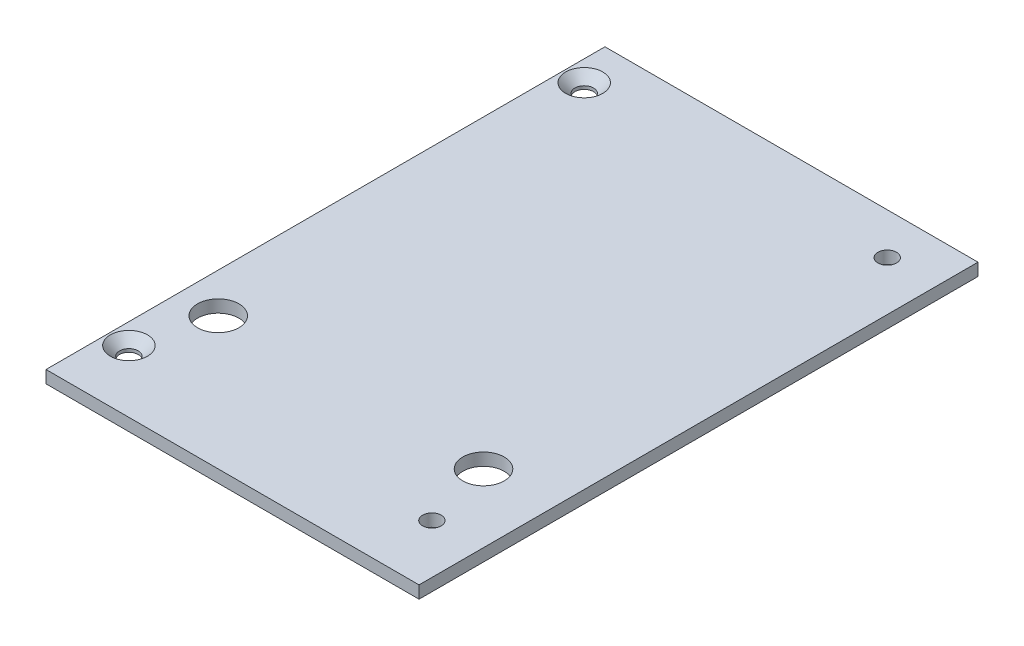
ISO-10303-21;
HEADER;
FILE_DESCRIPTION(('STEP AP214'),'2;1');
FILE_NAME('part.step','',(''),(''),'','','');
FILE_SCHEMA(('AUTOMOTIVE_DESIGN { 1 0 10303 214 1 1 1 1 }'));
ENDSEC;
DATA;
#1=APPLICATION_CONTEXT('core data for automotive mechanical design processes');
#2=APPLICATION_PROTOCOL_DEFINITION('international standard','automotive_design',2000,#1);
#3=PRODUCT_CONTEXT('',#1,'mechanical');
#4=PRODUCT('Part','Part','',(#3));
#5=PRODUCT_RELATED_PRODUCT_CATEGORY('part','',(#4));
#6=PRODUCT_DEFINITION_FORMATION('','',#4);
#7=PRODUCT_DEFINITION_CONTEXT('part definition',#1,'design');
#8=PRODUCT_DEFINITION('design','',#6,#7);
#9=PRODUCT_DEFINITION_SHAPE('','',#8);
#10=(LENGTH_UNIT() NAMED_UNIT(*) SI_UNIT(.MILLI.,.METRE.));
#11=(NAMED_UNIT(*) PLANE_ANGLE_UNIT() SI_UNIT($,.RADIAN.));
#12=(NAMED_UNIT(*) SI_UNIT($,.STERADIAN.) SOLID_ANGLE_UNIT());
#13=UNCERTAINTY_MEASURE_WITH_UNIT(LENGTH_MEASURE(1.E-05),#10,'distance_accuracy_value','');
#14=(GEOMETRIC_REPRESENTATION_CONTEXT(3) GLOBAL_UNCERTAINTY_ASSIGNED_CONTEXT((#13)) GLOBAL_UNIT_ASSIGNED_CONTEXT((#10,
#11,#12)) REPRESENTATION_CONTEXT('',''));
#15=CARTESIAN_POINT('',(0.,0.,0.));
#16=DIRECTION('',(0.,0.,1.));
#17=DIRECTION('',(1.,0.,0.));
#18=AXIS2_PLACEMENT_3D('',#15,#16,#17);
#19=CARTESIAN_POINT('',(0.,3.,0.));
#20=DIRECTION('',(0.,-1.,0.));
#21=DIRECTION('',(0.,0.,-1.));
#22=AXIS2_PLACEMENT_3D('',#19,#20,#21);
#23=PLANE('',#22);
#24=CARTESIAN_POINT('',(-40.,3.,52.425));
#25=DIRECTION('',(0.,1.,0.));
#26=DIRECTION('',(0.,0.,1.));
#27=AXIS2_PLACEMENT_3D('',#24,#25,#26);
#28=CIRCLE('',#27,4.48);
#29=CARTESIAN_POINT('',(-40.,3.,56.905));
#30=VERTEX_POINT('',#29);
#31=EDGE_CURVE('E522',#30,#30,#28,.T.);
#32=ORIENTED_EDGE('',*,*,#31,.F.);
#33=EDGE_LOOP('',(#32));
#34=FACE_BOUND('',#33,.T.);
#35=CARTESIAN_POINT('',(33.1,3.,52.425));
#36=DIRECTION('',(0.,1.,0.));
#37=DIRECTION('',(0.,0.,1.));
#38=AXIS2_PLACEMENT_3D('',#35,#36,#37);
#39=CIRCLE('',#38,2.24999999999319);
#40=CARTESIAN_POINT('',(33.1,3.,54.6749999999932));
#41=VERTEX_POINT('',#40);
#42=EDGE_CURVE('E267',#41,#41,#39,.T.);
#43=ORIENTED_EDGE('',*,*,#42,.F.);
#44=EDGE_LOOP('',(#43));
#45=FACE_BOUND('',#44,.T.);
#46=CARTESIAN_POINT('',(33.1,3.,-57.425));
#47=DIRECTION('',(0.,1.,0.));
#48=DIRECTION('',(0.,0.,1.));
#49=AXIS2_PLACEMENT_3D('',#46,#47,#48);
#50=CIRCLE('',#49,2.24999999999318);
#51=CARTESIAN_POINT('',(33.1,3.,-55.1750000000068));
#52=VERTEX_POINT('',#51);
#53=EDGE_CURVE('E273',#52,#52,#50,.T.);
#54=ORIENTED_EDGE('',*,*,#53,.F.);
#55=EDGE_LOOP('',(#54));
#56=FACE_BOUND('',#55,.T.);
#57=DIRECTION('',(0.,0.,-1.));
#58=VECTOR('',#57,1.);
#59=CARTESIAN_POINT('',(45.,3.,67.425));
#60=LINE('',#59,#58);
#61=CARTESIAN_POINT('',(45.,3.,67.425));
#62=VERTEX_POINT('',#61);
#63=CARTESIAN_POINT('',(45.,3.,-67.425));
#64=VERTEX_POINT('',#63);
#65=EDGE_CURVE('E282',#62,#64,#60,.T.);
#66=ORIENTED_EDGE('',*,*,#65,.T.);
#67=DIRECTION('',(-1.,0.,0.));
#68=VECTOR('',#67,1.);
#69=CARTESIAN_POINT('',(-45.,3.,-67.425));
#70=LINE('',#69,#68);
#71=CARTESIAN_POINT('',(-45.,3.,-67.425));
#72=VERTEX_POINT('',#71);
#73=EDGE_CURVE('E285',#64,#72,#70,.T.);
#74=ORIENTED_EDGE('',*,*,#73,.T.);
#75=DIRECTION('',(0.,0.,1.));
#76=VECTOR('',#75,1.);
#77=CARTESIAN_POINT('',(-45.,3.,67.425));
#78=LINE('',#77,#76);
#79=CARTESIAN_POINT('',(-45.,3.,67.425));
#80=VERTEX_POINT('',#79);
#81=EDGE_CURVE('E288',#72,#80,#78,.T.);
#82=ORIENTED_EDGE('',*,*,#81,.T.);
#83=DIRECTION('',(1.,0.,0.));
#84=VECTOR('',#83,1.);
#85=CARTESIAN_POINT('',(-45.,3.,67.425));
#86=LINE('',#85,#84);
#87=EDGE_CURVE('E290',#80,#62,#86,.T.);
#88=ORIENTED_EDGE('',*,*,#87,.T.);
#89=EDGE_LOOP('',(#66,#74,#82,#88));
#90=FACE_BOUND('',#89,.T.);
#91=CARTESIAN_POINT('',(28.55,3.,35.425));
#92=DIRECTION('',(0.,-1.,0.));
#93=DIRECTION('',(0.,0.,-1.));
#94=AXIS2_PLACEMENT_3D('',#91,#92,#93);
#95=CIRCLE('',#94,5.);
#96=CARTESIAN_POINT('',(28.55,3.,30.425));
#97=VERTEX_POINT('',#96);
#98=EDGE_CURVE('E255',#97,#97,#95,.T.);
#99=ORIENTED_EDGE('',*,*,#98,.T.);
#100=EDGE_LOOP('',(#99));
#101=FACE_BOUND('',#100,.T.);
#102=CARTESIAN_POINT('',(-35.45,3.,35.425));
#103=DIRECTION('',(0.,-1.,0.));
#104=DIRECTION('',(0.,0.,-1.));
#105=AXIS2_PLACEMENT_3D('',#102,#103,#104);
#106=CIRCLE('',#105,5.00000000000001);
#107=CARTESIAN_POINT('',(-35.45,3.,30.425));
#108=VERTEX_POINT('',#107);
#109=EDGE_CURVE('E260',#108,#108,#106,.T.);
#110=ORIENTED_EDGE('',*,*,#109,.T.);
#111=EDGE_LOOP('',(#110));
#112=FACE_BOUND('',#111,.T.);
#113=CARTESIAN_POINT('',(-40.,3.,-57.425));
#114=DIRECTION('',(0.,1.,0.));
#115=DIRECTION('',(0.,0.,1.));
#116=AXIS2_PLACEMENT_3D('',#113,#114,#115);
#117=CIRCLE('',#116,4.48);
#118=CARTESIAN_POINT('',(-40.,3.,-52.945));
#119=VERTEX_POINT('',#118);
#120=EDGE_CURVE('E517',#119,#119,#117,.T.);
#121=ORIENTED_EDGE('',*,*,#120,.F.);
#122=EDGE_LOOP('',(#121));
#123=FACE_BOUND('',#122,.T.);
#124=ADVANCED_FACE('F39',(#34,#45,#56,#90,#101,#112,#123),#23,.F.);
#125=CARTESIAN_POINT('',(-40.,3.,-57.425));
#126=DIRECTION('',(0.,-1.,0.));
#127=DIRECTION('',(0.,0.,-1.));
#128=AXIS2_PLACEMENT_3D('',#125,#126,#127);
#129=CYLINDRICAL_SURFACE('',#128,2.24999999999319);
#130=CARTESIAN_POINT('',(-40.,0.,-57.425));
#131=DIRECTION('',(0.,1.,0.));
#132=DIRECTION('',(0.,0.,1.));
#133=AXIS2_PLACEMENT_3D('',#130,#131,#132);
#134=CIRCLE('',#133,2.24999999999319);
#135=CARTESIAN_POINT('',(-40.,0.,-55.1750000000068));
#136=VERTEX_POINT('',#135);
#137=EDGE_CURVE('E276',#136,#136,#134,.T.);
#138=ORIENTED_EDGE('',*,*,#137,.F.);
#139=EDGE_LOOP('',(#138));
#140=FACE_BOUND('',#139,.T.);
#141=CARTESIAN_POINT('',(-40.,0.769999999999999,-57.425));
#142=DIRECTION('',(0.,1.,0.));
#143=DIRECTION('',(0.,0.,1.));
#144=AXIS2_PLACEMENT_3D('',#141,#142,#143);
#145=CIRCLE('',#144,2.25);
#146=CARTESIAN_POINT('',(-40.,0.769999999999999,-55.175));
#147=VERTEX_POINT('',#146);
#148=EDGE_CURVE('E185',#147,#147,#145,.T.);
#149=ORIENTED_EDGE('',*,*,#148,.T.);
#150=EDGE_LOOP('',(#149));
#151=FACE_BOUND('',#150,.T.);
#152=ADVANCED_FACE('F331',(#140,#151),#129,.F.);
#153=CARTESIAN_POINT('',(0.,0.,0.));
#154=DIRECTION('',(0.,-1.,0.));
#155=DIRECTION('',(0.,0.,-1.));
#156=AXIS2_PLACEMENT_3D('',#153,#154,#155);
#157=PLANE('',#156);
#158=CARTESIAN_POINT('',(-40.,0.,52.425));
#159=DIRECTION('',(0.,1.,0.));
#160=DIRECTION('',(0.,0.,1.));
#161=AXIS2_PLACEMENT_3D('',#158,#159,#160);
#162=CIRCLE('',#161,2.24999999999316);
#163=CARTESIAN_POINT('',(-40.,0.,54.6749999999932));
#164=VERTEX_POINT('',#163);
#165=EDGE_CURVE('E263',#164,#164,#162,.T.);
#166=ORIENTED_EDGE('',*,*,#165,.T.);
#167=EDGE_LOOP('',(#166));
#168=FACE_BOUND('',#167,.T.);
#169=CARTESIAN_POINT('',(33.1,0.,-57.425));
#170=DIRECTION('',(0.,1.,0.));
#171=DIRECTION('',(0.,0.,1.));
#172=AXIS2_PLACEMENT_3D('',#169,#170,#171);
#173=CIRCLE('',#172,2.24999999999318);
#174=CARTESIAN_POINT('',(33.1,0.,-55.1750000000068));
#175=VERTEX_POINT('',#174);
#176=EDGE_CURVE('E270',#175,#175,#173,.T.);
#177=ORIENTED_EDGE('',*,*,#176,.T.);
#178=EDGE_LOOP('',(#177));
#179=FACE_BOUND('',#178,.T.);
#180=DIRECTION('',(0.,0.,-1.));
#181=VECTOR('',#180,1.);
#182=CARTESIAN_POINT('',(45.,0.,67.425));
#183=LINE('',#182,#181);
#184=CARTESIAN_POINT('',(45.,0.,67.425));
#185=VERTEX_POINT('',#184);
#186=CARTESIAN_POINT('',(45.,0.,-67.425));
#187=VERTEX_POINT('',#186);
#188=EDGE_CURVE('E281',#185,#187,#183,.T.);
#189=ORIENTED_EDGE('',*,*,#188,.F.);
#190=DIRECTION('',(1.,0.,0.));
#191=VECTOR('',#190,1.);
#192=CARTESIAN_POINT('',(-45.,0.,67.425));
#193=LINE('',#192,#191);
#194=CARTESIAN_POINT('',(-45.,0.,67.425));
#195=VERTEX_POINT('',#194);
#196=EDGE_CURVE('E286',#195,#185,#193,.T.);
#197=ORIENTED_EDGE('',*,*,#196,.F.);
#198=DIRECTION('',(0.,0.,1.));
#199=VECTOR('',#198,1.);
#200=CARTESIAN_POINT('',(-45.,0.,67.425));
#201=LINE('',#200,#199);
#202=CARTESIAN_POINT('',(-45.,0.,-67.425));
#203=VERTEX_POINT('',#202);
#204=EDGE_CURVE('E297',#203,#195,#201,.T.);
#205=ORIENTED_EDGE('',*,*,#204,.F.);
#206=DIRECTION('',(-1.,0.,0.));
#207=VECTOR('',#206,1.);
#208=CARTESIAN_POINT('',(-45.,0.,-67.425));
#209=LINE('',#208,#207);
#210=EDGE_CURVE('E295',#187,#203,#209,.T.);
#211=ORIENTED_EDGE('',*,*,#210,.F.);
#212=EDGE_LOOP('',(#189,#197,#205,#211));
#213=FACE_BOUND('',#212,.T.);
#214=ORIENTED_EDGE('',*,*,#137,.T.);
#215=EDGE_LOOP('',(#214));
#216=FACE_BOUND('',#215,.T.);
#217=CARTESIAN_POINT('',(33.1,0.,52.425));
#218=DIRECTION('',(0.,1.,0.));
#219=DIRECTION('',(0.,0.,1.));
#220=AXIS2_PLACEMENT_3D('',#217,#218,#219);
#221=CIRCLE('',#220,2.24999999999319);
#222=CARTESIAN_POINT('',(33.1,0.,54.6749999999932));
#223=VERTEX_POINT('',#222);
#224=EDGE_CURVE('E266',#223,#223,#221,.T.);
#225=ORIENTED_EDGE('',*,*,#224,.T.);
#226=EDGE_LOOP('',(#225));
#227=FACE_BOUND('',#226,.T.);
#228=CARTESIAN_POINT('',(28.55,0.,35.425));
#229=DIRECTION('',(0.,-1.,0.));
#230=DIRECTION('',(0.,0.,-1.));
#231=AXIS2_PLACEMENT_3D('',#228,#229,#230);
#232=CIRCLE('',#231,5.);
#233=CARTESIAN_POINT('',(28.55,0.,30.425));
#234=VERTEX_POINT('',#233);
#235=EDGE_CURVE('E251',#234,#234,#232,.T.);
#236=ORIENTED_EDGE('',*,*,#235,.F.);
#237=EDGE_LOOP('',(#236));
#238=FACE_BOUND('',#237,.T.);
#239=CARTESIAN_POINT('',(-35.45,0.,35.425));
#240=DIRECTION('',(0.,-1.,0.));
#241=DIRECTION('',(0.,0.,-1.));
#242=AXIS2_PLACEMENT_3D('',#239,#240,#241);
#243=CIRCLE('',#242,5.00000000000001);
#244=CARTESIAN_POINT('',(-35.45,0.,30.425));
#245=VERTEX_POINT('',#244);
#246=EDGE_CURVE('E252',#245,#245,#243,.T.);
#247=ORIENTED_EDGE('',*,*,#246,.F.);
#248=EDGE_LOOP('',(#247));
#249=FACE_BOUND('',#248,.T.);
#250=DIRECTION('',(0.,0.,-1.));
#251=VECTOR('',#250,1.);
#252=CARTESIAN_POINT('',(-34.6,0.,-0.380630601541221));
#253=LINE('',#252,#251);
#254=CARTESIAN_POINT('',(-34.6,0.,-0.380630601541221));
#255=VERTEX_POINT('',#254);
#256=CARTESIAN_POINT('',(-34.6,0.,-67.025));
#257=VERTEX_POINT('',#256);
#258=EDGE_CURVE('E216',#255,#257,#253,.T.);
#259=ORIENTED_EDGE('',*,*,#258,.F.);
#260=CARTESIAN_POINT('',(-30.0000000000001,0.,-0.38063060154122));
#261=DIRECTION('',(0.,-1.,0.));
#262=DIRECTION('',(0.,0.,-1.));
#263=AXIS2_PLACEMENT_3D('',#260,#261,#262);
#264=CIRCLE('',#263,4.59999999999989);
#265=CARTESIAN_POINT('',(-33.8902654821632,0.,2.07412691770368));
#266=VERTEX_POINT('',#265);
#267=EDGE_CURVE('E194',#266,#255,#264,.T.);
#268=ORIENTED_EDGE('',*,*,#267,.F.);
#269=DIRECTION('',(-0.533642938966297,0.,-0.845709887426778));
#270=VECTOR('',#269,1.);
#271=CARTESIAN_POINT('',(-7.34026548216318,0.,44.15019664829));
#272=LINE('',#271,#270);
#273=CARTESIAN_POINT('',(-7.34026548216318,0.,44.15019664829));
#274=VERTEX_POINT('',#273);
#275=EDGE_CURVE('E199',#274,#266,#272,.T.);
#276=ORIENTED_EDGE('',*,*,#275,.F.);
#277=CARTESIAN_POINT('',(-3.45000000000003,0.,41.6954391290451));
#278=DIRECTION('',(0.,-1.,0.));
#279=DIRECTION('',(0.,0.,-1.));
#280=AXIS2_PLACEMENT_3D('',#277,#278,#279);
#281=CIRCLE('',#280,4.59999999999997);
#282=CARTESIAN_POINT('',(0.440265482163121,0.,44.15019664829));
#283=VERTEX_POINT('',#282);
#284=EDGE_CURVE('E226',#283,#274,#281,.T.);
#285=ORIENTED_EDGE('',*,*,#284,.F.);
#286=DIRECTION('',(-0.533642938966294,0.,0.845709887426779));
#287=VECTOR('',#286,1.);
#288=CARTESIAN_POINT('',(26.990265482163,0.,2.07412691770361));
#289=LINE('',#288,#287);
#290=CARTESIAN_POINT('',(26.990265482163,0.,2.07412691770361));
#291=VERTEX_POINT('',#290);
#292=EDGE_CURVE('E224',#291,#283,#289,.T.);
#293=ORIENTED_EDGE('',*,*,#292,.F.);
#294=CARTESIAN_POINT('',(23.1000000000011,0.,-0.380630601541296));
#295=DIRECTION('',(0.,-1.,0.));
#296=DIRECTION('',(0.,0.,-1.));
#297=AXIS2_PLACEMENT_3D('',#294,#295,#296);
#298=CIRCLE('',#297,4.59999999999883);
#299=CARTESIAN_POINT('',(27.7,0.,-0.380630601541296));
#300=VERTEX_POINT('',#299);
#301=EDGE_CURVE('E222',#300,#291,#298,.T.);
#302=ORIENTED_EDGE('',*,*,#301,.F.);
#303=DIRECTION('',(0.,0.,1.));
#304=VECTOR('',#303,1.);
#305=CARTESIAN_POINT('',(27.7,0.,-67.025));
#306=LINE('',#305,#304);
#307=CARTESIAN_POINT('',(27.7,0.,-67.025));
#308=VERTEX_POINT('',#307);
#309=EDGE_CURVE('E220',#308,#300,#306,.T.);
#310=ORIENTED_EDGE('',*,*,#309,.F.);
#311=DIRECTION('',(1.,0.,0.));
#312=VECTOR('',#311,1.);
#313=CARTESIAN_POINT('',(-34.6,0.,-67.025));
#314=LINE('',#313,#312);
#315=EDGE_CURVE('E218',#257,#308,#314,.T.);
#316=ORIENTED_EDGE('',*,*,#315,.F.);
#317=EDGE_LOOP('',(#259,#268,#276,#285,#293,#302,#310,#316));
#318=FACE_BOUND('',#317,.T.);
#319=ADVANCED_FACE('F329',(#168,#179,#213,#216,#227,#238,#249,#318),#157,.T.);
#320=CARTESIAN_POINT('',(45.,3.,67.425));
#321=DIRECTION('',(-1.,0.,0.));
#322=DIRECTION('',(0.,0.,1.));
#323=AXIS2_PLACEMENT_3D('',#320,#321,#322);
#324=PLANE('',#323);
#325=ORIENTED_EDGE('',*,*,#188,.T.);
#326=DIRECTION('',(0.,-1.,0.));
#327=VECTOR('',#326,1.);
#328=CARTESIAN_POINT('',(45.,3.,-67.425));
#329=LINE('',#328,#327);
#330=EDGE_CURVE('E308',#64,#187,#329,.T.);
#331=ORIENTED_EDGE('',*,*,#330,.F.);
#332=ORIENTED_EDGE('',*,*,#65,.F.);
#333=DIRECTION('',(0.,-1.,0.));
#334=VECTOR('',#333,1.);
#335=CARTESIAN_POINT('',(45.,3.,67.425));
#336=LINE('',#335,#334);
#337=EDGE_CURVE('E292',#62,#185,#336,.T.);
#338=ORIENTED_EDGE('',*,*,#337,.T.);
#339=EDGE_LOOP('',(#325,#331,#332,#338));
#340=FACE_BOUND('',#339,.T.);
#341=ADVANCED_FACE('F356',(#340),#324,.F.);
#342=CARTESIAN_POINT('',(-45.,3.,-67.425));
#343=DIRECTION('',(0.,0.,1.));
#344=DIRECTION('',(1.,0.,0.));
#345=AXIS2_PLACEMENT_3D('',#342,#343,#344);
#346=PLANE('',#345);
#347=ORIENTED_EDGE('',*,*,#210,.T.);
#348=DIRECTION('',(0.,-1.,0.));
#349=VECTOR('',#348,1.);
#350=CARTESIAN_POINT('',(-45.,3.,-67.425));
#351=LINE('',#350,#349);
#352=EDGE_CURVE('E305',#72,#203,#351,.T.);
#353=ORIENTED_EDGE('',*,*,#352,.F.);
#354=ORIENTED_EDGE('',*,*,#73,.F.);
#355=ORIENTED_EDGE('',*,*,#330,.T.);
#356=EDGE_LOOP('',(#347,#353,#354,#355));
#357=FACE_BOUND('',#356,.T.);
#358=ADVANCED_FACE('F352',(#357),#346,.F.);
#359=CARTESIAN_POINT('',(-45.,3.,67.425));
#360=DIRECTION('',(1.,0.,0.));
#361=DIRECTION('',(0.,0.,-1.));
#362=AXIS2_PLACEMENT_3D('',#359,#360,#361);
#363=PLANE('',#362);
#364=ORIENTED_EDGE('',*,*,#204,.T.);
#365=DIRECTION('',(0.,-1.,0.));
#366=VECTOR('',#365,1.);
#367=CARTESIAN_POINT('',(-45.,3.,67.425));
#368=LINE('',#367,#366);
#369=EDGE_CURVE('E302',#80,#195,#368,.T.);
#370=ORIENTED_EDGE('',*,*,#369,.F.);
#371=ORIENTED_EDGE('',*,*,#81,.F.);
#372=ORIENTED_EDGE('',*,*,#352,.T.);
#373=EDGE_LOOP('',(#364,#370,#371,#372));
#374=FACE_BOUND('',#373,.T.);
#375=ADVANCED_FACE('F348',(#374),#363,.F.);
#376=CARTESIAN_POINT('',(-45.,3.,67.425));
#377=DIRECTION('',(0.,0.,-1.));
#378=DIRECTION('',(-1.,0.,0.));
#379=AXIS2_PLACEMENT_3D('',#376,#377,#378);
#380=PLANE('',#379);
#381=ORIENTED_EDGE('',*,*,#196,.T.);
#382=ORIENTED_EDGE('',*,*,#337,.F.);
#383=ORIENTED_EDGE('',*,*,#87,.F.);
#384=ORIENTED_EDGE('',*,*,#369,.T.);
#385=EDGE_LOOP('',(#381,#382,#383,#384));
#386=FACE_BOUND('',#385,.T.);
#387=ADVANCED_FACE('F344',(#386),#380,.F.);
#388=CARTESIAN_POINT('',(33.1,3.,-57.425));
#389=DIRECTION('',(0.,-1.,0.));
#390=DIRECTION('',(0.,0.,-1.));
#391=AXIS2_PLACEMENT_3D('',#388,#389,#390);
#392=CYLINDRICAL_SURFACE('',#391,2.24999999999318);
#393=ORIENTED_EDGE('',*,*,#53,.T.);
#394=EDGE_LOOP('',(#393));
#395=FACE_BOUND('',#394,.T.);
#396=ORIENTED_EDGE('',*,*,#176,.F.);
#397=EDGE_LOOP('',(#396));
#398=FACE_BOUND('',#397,.T.);
#399=ADVANCED_FACE('F347',(#395,#398),#392,.F.);
#400=CARTESIAN_POINT('',(33.1,3.,52.425));
#401=DIRECTION('',(0.,-1.,0.));
#402=DIRECTION('',(0.,0.,-1.));
#403=AXIS2_PLACEMENT_3D('',#400,#401,#402);
#404=CYLINDRICAL_SURFACE('',#403,2.24999999999319);
#405=ORIENTED_EDGE('',*,*,#42,.T.);
#406=EDGE_LOOP('',(#405));
#407=FACE_BOUND('',#406,.T.);
#408=ORIENTED_EDGE('',*,*,#224,.F.);
#409=EDGE_LOOP('',(#408));
#410=FACE_BOUND('',#409,.T.);
#411=ADVANCED_FACE('F462',(#407,#410),#404,.F.);
#412=CARTESIAN_POINT('',(-40.,3.,52.425));
#413=DIRECTION('',(0.,-1.,0.));
#414=DIRECTION('',(0.,0.,-1.));
#415=AXIS2_PLACEMENT_3D('',#412,#413,#414);
#416=CYLINDRICAL_SURFACE('',#415,2.24999999999316);
#417=CARTESIAN_POINT('',(-40.,0.769999999999999,52.425));
#418=DIRECTION('',(0.,1.,0.));
#419=DIRECTION('',(0.,0.,1.));
#420=AXIS2_PLACEMENT_3D('',#417,#418,#419);
#421=CIRCLE('',#420,2.25);
#422=CARTESIAN_POINT('',(-40.,0.769999999999999,54.675));
#423=VERTEX_POINT('',#422);
#424=EDGE_CURVE('E519',#423,#423,#421,.T.);
#425=ORIENTED_EDGE('',*,*,#424,.T.);
#426=EDGE_LOOP('',(#425));
#427=FACE_BOUND('',#426,.T.);
#428=ORIENTED_EDGE('',*,*,#165,.F.);
#429=EDGE_LOOP('',(#428));
#430=FACE_BOUND('',#429,.T.);
#431=ADVANCED_FACE('F459',(#427,#430),#416,.F.);
#432=CARTESIAN_POINT('',(28.55,10.,35.425));
#433=DIRECTION('',(0.,-1.,0.));
#434=DIRECTION('',(0.,0.,-1.));
#435=AXIS2_PLACEMENT_3D('',#432,#433,#434);
#436=CYLINDRICAL_SURFACE('',#435,5.);
#437=ORIENTED_EDGE('',*,*,#235,.T.);
#438=EDGE_LOOP('',(#437));
#439=FACE_BOUND('',#438,.T.);
#440=ORIENTED_EDGE('',*,*,#98,.F.);
#441=EDGE_LOOP('',(#440));
#442=FACE_BOUND('',#441,.T.);
#443=ADVANCED_FACE('F455',(#439,#442),#436,.F.);
#444=CARTESIAN_POINT('',(-35.45,10.,35.425));
#445=DIRECTION('',(0.,-1.,0.));
#446=DIRECTION('',(0.,0.,-1.));
#447=AXIS2_PLACEMENT_3D('',#444,#445,#446);
#448=CYLINDRICAL_SURFACE('',#447,5.00000000000001);
#449=ORIENTED_EDGE('',*,*,#246,.T.);
#450=EDGE_LOOP('',(#449));
#451=FACE_BOUND('',#450,.T.);
#452=ORIENTED_EDGE('',*,*,#109,.F.);
#453=EDGE_LOOP('',(#452));
#454=FACE_BOUND('',#453,.T.);
#455=ADVANCED_FACE('F421',(#451,#454),#448,.F.);
#456=CARTESIAN_POINT('',(-30.0000000000001,-3.,-0.38063060154122));
#457=DIRECTION('',(0.,-1.,0.));
#458=DIRECTION('',(0.,0.,-1.));
#459=AXIS2_PLACEMENT_3D('',#456,#457,#458);
#460=PLANE('',#459);
#461=CARTESIAN_POINT('',(-30.0000000000001,-3.,-0.38063060154122));
#462=DIRECTION('',(0.,-1.,0.));
#463=DIRECTION('',(0.,0.,-1.));
#464=AXIS2_PLACEMENT_3D('',#461,#462,#463);
#465=CIRCLE('',#464,4.59999999999989);
#466=CARTESIAN_POINT('',(-33.8902654821632,-3.,2.07412691770368));
#467=VERTEX_POINT('',#466);
#468=CARTESIAN_POINT('',(-34.6,-3.,-0.380630601541221));
#469=VERTEX_POINT('',#468);
#470=EDGE_CURVE('E195',#467,#469,#465,.T.);
#471=ORIENTED_EDGE('',*,*,#470,.T.);
#472=DIRECTION('',(0.,0.,-1.));
#473=VECTOR('',#472,1.);
#474=CARTESIAN_POINT('',(-34.6,-3.,-0.380630601541221));
#475=LINE('',#474,#473);
#476=CARTESIAN_POINT('',(-34.6,-3.,-67.025));
#477=VERTEX_POINT('',#476);
#478=EDGE_CURVE('E198',#469,#477,#475,.T.);
#479=ORIENTED_EDGE('',*,*,#478,.T.);
#480=DIRECTION('',(1.,0.,0.));
#481=VECTOR('',#480,1.);
#482=CARTESIAN_POINT('',(-34.6,-3.,-67.025));
#483=LINE('',#482,#481);
#484=CARTESIAN_POINT('',(27.7,-3.,-67.025));
#485=VERTEX_POINT('',#484);
#486=EDGE_CURVE('E201',#477,#485,#483,.T.);
#487=ORIENTED_EDGE('',*,*,#486,.T.);
#488=DIRECTION('',(0.,0.,1.));
#489=VECTOR('',#488,1.);
#490=CARTESIAN_POINT('',(27.7,-3.,-67.025));
#491=LINE('',#490,#489);
#492=CARTESIAN_POINT('',(27.7,-3.,-0.380630601541296));
#493=VERTEX_POINT('',#492);
#494=EDGE_CURVE('E203',#485,#493,#491,.T.);
#495=ORIENTED_EDGE('',*,*,#494,.T.);
#496=CARTESIAN_POINT('',(23.1000000000011,-3.,-0.380630601541296));
#497=DIRECTION('',(0.,-1.,0.));
#498=DIRECTION('',(0.,0.,-1.));
#499=AXIS2_PLACEMENT_3D('',#496,#497,#498);
#500=CIRCLE('',#499,4.59999999999883);
#501=CARTESIAN_POINT('',(26.990265482163,-3.,2.07412691770361));
#502=VERTEX_POINT('',#501);
#503=EDGE_CURVE('E205',#493,#502,#500,.T.);
#504=ORIENTED_EDGE('',*,*,#503,.T.);
#505=DIRECTION('',(-0.533642938966294,0.,0.845709887426779));
#506=VECTOR('',#505,1.);
#507=CARTESIAN_POINT('',(26.990265482163,-3.,2.07412691770361));
#508=LINE('',#507,#506);
#509=CARTESIAN_POINT('',(0.440265482163121,-3.,44.15019664829));
#510=VERTEX_POINT('',#509);
#511=EDGE_CURVE('E207',#502,#510,#508,.T.);
#512=ORIENTED_EDGE('',*,*,#511,.T.);
#513=CARTESIAN_POINT('',(-3.45000000000003,-3.,41.6954391290451));
#514=DIRECTION('',(0.,-1.,0.));
#515=DIRECTION('',(0.,0.,-1.));
#516=AXIS2_PLACEMENT_3D('',#513,#514,#515);
#517=CIRCLE('',#516,4.59999999999997);
#518=CARTESIAN_POINT('',(-7.34026548216318,-3.,44.15019664829));
#519=VERTEX_POINT('',#518);
#520=EDGE_CURVE('E209',#510,#519,#517,.T.);
#521=ORIENTED_EDGE('',*,*,#520,.T.);
#522=DIRECTION('',(-0.533642938966297,0.,-0.845709887426778));
#523=VECTOR('',#522,1.);
#524=CARTESIAN_POINT('',(-7.34026548216318,-3.,44.15019664829));
#525=LINE('',#524,#523);
#526=EDGE_CURVE('E211',#519,#467,#525,.T.);
#527=ORIENTED_EDGE('',*,*,#526,.T.);
#528=EDGE_LOOP('',(#471,#479,#487,#495,#504,#512,#521,#527));
#529=FACE_BOUND('',#528,.T.);
#530=DIRECTION('',(0.,0.,-1.));
#531=VECTOR('',#530,1.);
#532=CARTESIAN_POINT('',(-29.6,-3.,-0.49628104966457));
#533=LINE('',#532,#531);
#534=CARTESIAN_POINT('',(-29.6,-3.,-0.49628104966457));
#535=VERTEX_POINT('',#534);
#536=CARTESIAN_POINT('',(-29.6,-3.,-62.025));
#537=VERTEX_POINT('',#536);
#538=EDGE_CURVE('E157',#535,#537,#533,.T.);
#539=ORIENTED_EDGE('',*,*,#538,.F.);
#540=DIRECTION('',(-0.533642938966297,0.,-0.845709887426778));
#541=VECTOR('',#540,1.);
#542=CARTESIAN_POINT('',(-3.45000000000003,-3.,40.9458742593686));
#543=LINE('',#542,#541);
#544=CARTESIAN_POINT('',(-3.45000000000003,-3.,40.9458742593686));
#545=VERTEX_POINT('',#544);
#546=EDGE_CURVE('E162',#545,#535,#543,.T.);
#547=ORIENTED_EDGE('',*,*,#546,.F.);
#548=DIRECTION('',(-0.533642938966294,0.,0.84570988742678));
#549=VECTOR('',#548,1.);
#550=CARTESIAN_POINT('',(22.7,-3.,-0.496281049664938));
#551=LINE('',#550,#549);
#552=CARTESIAN_POINT('',(22.7,-3.,-0.49628104966494));
#553=VERTEX_POINT('',#552);
#554=EDGE_CURVE('E192',#553,#545,#551,.T.);
#555=ORIENTED_EDGE('',*,*,#554,.F.);
#556=DIRECTION('',(0.,0.,1.));
#557=VECTOR('',#556,1.);
#558=CARTESIAN_POINT('',(22.7,-3.,-62.025));
#559=LINE('',#558,#557);
#560=CARTESIAN_POINT('',(22.7,-3.,-62.025));
#561=VERTEX_POINT('',#560);
#562=EDGE_CURVE('E189',#561,#553,#559,.T.);
#563=ORIENTED_EDGE('',*,*,#562,.F.);
#564=DIRECTION('',(1.,0.,0.));
#565=VECTOR('',#564,1.);
#566=CARTESIAN_POINT('',(-29.6,-3.,-62.025));
#567=LINE('',#566,#565);
#568=EDGE_CURVE('E165',#537,#561,#567,.T.);
#569=ORIENTED_EDGE('',*,*,#568,.F.);
#570=EDGE_LOOP('',(#539,#547,#555,#563,#569));
#571=FACE_BOUND('',#570,.T.);
#572=ADVANCED_FACE('F159',(#529,#571),#460,.T.);
#573=CARTESIAN_POINT('',(-30.0000000000001,-3.,-0.38063060154122));
#574=DIRECTION('',(0.,1.,0.));
#575=DIRECTION('',(0.,0.,1.));
#576=AXIS2_PLACEMENT_3D('',#573,#574,#575);
#577=CYLINDRICAL_SURFACE('',#576,4.59999999999989);
#578=ORIENTED_EDGE('',*,*,#267,.T.);
#579=DIRECTION('',(0.,1.,0.));
#580=VECTOR('',#579,1.);
#581=CARTESIAN_POINT('',(-34.6,-3.,-0.380630601541221));
#582=LINE('',#581,#580);
#583=EDGE_CURVE('E249',#469,#255,#582,.T.);
#584=ORIENTED_EDGE('',*,*,#583,.F.);
#585=ORIENTED_EDGE('',*,*,#470,.F.);
#586=DIRECTION('',(0.,1.,0.));
#587=VECTOR('',#586,1.);
#588=CARTESIAN_POINT('',(-33.8902654821632,-3.,2.07412691770368));
#589=LINE('',#588,#587);
#590=EDGE_CURVE('E213',#467,#266,#589,.T.);
#591=ORIENTED_EDGE('',*,*,#590,.T.);
#592=EDGE_LOOP('',(#578,#584,#585,#591));
#593=FACE_BOUND('',#592,.T.);
#594=ADVANCED_FACE('F420',(#593),#577,.T.);
#595=CARTESIAN_POINT('',(-34.6,-3.,-0.380630601541221));
#596=DIRECTION('',(1.,0.,0.));
#597=DIRECTION('',(0.,0.,-1.));
#598=AXIS2_PLACEMENT_3D('',#595,#596,#597);
#599=PLANE('',#598);
#600=ORIENTED_EDGE('',*,*,#258,.T.);
#601=DIRECTION('',(0.,1.,0.));
#602=VECTOR('',#601,1.);
#603=CARTESIAN_POINT('',(-34.6,-3.,-67.025));
#604=LINE('',#603,#602);
#605=EDGE_CURVE('E246',#477,#257,#604,.T.);
#606=ORIENTED_EDGE('',*,*,#605,.F.);
#607=ORIENTED_EDGE('',*,*,#478,.F.);
#608=ORIENTED_EDGE('',*,*,#583,.T.);
#609=EDGE_LOOP('',(#600,#606,#607,#608));
#610=FACE_BOUND('',#609,.T.);
#611=ADVANCED_FACE('F445',(#610),#599,.F.);
#612=CARTESIAN_POINT('',(-34.6,-3.,-67.025));
#613=DIRECTION('',(0.,0.,1.));
#614=DIRECTION('',(1.,0.,0.));
#615=AXIS2_PLACEMENT_3D('',#612,#613,#614);
#616=PLANE('',#615);
#617=ORIENTED_EDGE('',*,*,#315,.T.);
#618=DIRECTION('',(0.,1.,0.));
#619=VECTOR('',#618,1.);
#620=CARTESIAN_POINT('',(27.7,-3.,-67.025));
#621=LINE('',#620,#619);
#622=EDGE_CURVE('E243',#485,#308,#621,.T.);
#623=ORIENTED_EDGE('',*,*,#622,.F.);
#624=ORIENTED_EDGE('',*,*,#486,.F.);
#625=ORIENTED_EDGE('',*,*,#605,.T.);
#626=EDGE_LOOP('',(#617,#623,#624,#625));
#627=FACE_BOUND('',#626,.T.);
#628=ADVANCED_FACE('F441',(#627),#616,.F.);
#629=CARTESIAN_POINT('',(27.7,-3.,-67.025));
#630=DIRECTION('',(-1.,0.,0.));
#631=DIRECTION('',(0.,0.,1.));
#632=AXIS2_PLACEMENT_3D('',#629,#630,#631);
#633=PLANE('',#632);
#634=ORIENTED_EDGE('',*,*,#309,.T.);
#635=DIRECTION('',(0.,1.,0.));
#636=VECTOR('',#635,1.);
#637=CARTESIAN_POINT('',(27.7,-3.,-0.380630601541296));
#638=LINE('',#637,#636);
#639=EDGE_CURVE('E240',#493,#300,#638,.T.);
#640=ORIENTED_EDGE('',*,*,#639,.F.);
#641=ORIENTED_EDGE('',*,*,#494,.F.);
#642=ORIENTED_EDGE('',*,*,#622,.T.);
#643=EDGE_LOOP('',(#634,#640,#641,#642));
#644=FACE_BOUND('',#643,.T.);
#645=ADVANCED_FACE('F437',(#644),#633,.F.);
#646=CARTESIAN_POINT('',(23.1000000000011,-3.,-0.380630601541296));
#647=DIRECTION('',(0.,1.,0.));
#648=DIRECTION('',(0.,0.,1.));
#649=AXIS2_PLACEMENT_3D('',#646,#647,#648);
#650=CYLINDRICAL_SURFACE('',#649,4.59999999999883);
#651=ORIENTED_EDGE('',*,*,#301,.T.);
#652=DIRECTION('',(0.,1.,0.));
#653=VECTOR('',#652,1.);
#654=CARTESIAN_POINT('',(26.990265482163,-3.,2.07412691770361));
#655=LINE('',#654,#653);
#656=EDGE_CURVE('E237',#502,#291,#655,.T.);
#657=ORIENTED_EDGE('',*,*,#656,.F.);
#658=ORIENTED_EDGE('',*,*,#503,.F.);
#659=ORIENTED_EDGE('',*,*,#639,.T.);
#660=EDGE_LOOP('',(#651,#657,#658,#659));
#661=FACE_BOUND('',#660,.T.);
#662=ADVANCED_FACE('F433',(#661),#650,.T.);
#663=CARTESIAN_POINT('',(26.990265482163,-3.,2.07412691770361));
#664=DIRECTION('',(-0.845709887426779,0.,-0.533642938966294));
#665=DIRECTION('',(-0.533642938966294,0.,0.845709887426779));
#666=AXIS2_PLACEMENT_3D('',#663,#664,#665);
#667=PLANE('',#666);
#668=ORIENTED_EDGE('',*,*,#292,.T.);
#669=DIRECTION('',(0.,1.,0.));
#670=VECTOR('',#669,1.);
#671=CARTESIAN_POINT('',(0.440265482163121,-3.,44.15019664829));
#672=LINE('',#671,#670);
#673=EDGE_CURVE('E234',#510,#283,#672,.T.);
#674=ORIENTED_EDGE('',*,*,#673,.F.);
#675=ORIENTED_EDGE('',*,*,#511,.F.);
#676=ORIENTED_EDGE('',*,*,#656,.T.);
#677=EDGE_LOOP('',(#668,#674,#675,#676));
#678=FACE_BOUND('',#677,.T.);
#679=ADVANCED_FACE('F429',(#678),#667,.F.);
#680=CARTESIAN_POINT('',(-3.45000000000003,-3.,41.6954391290451));
#681=DIRECTION('',(0.,1.,0.));
#682=DIRECTION('',(0.,0.,1.));
#683=AXIS2_PLACEMENT_3D('',#680,#681,#682);
#684=CYLINDRICAL_SURFACE('',#683,4.59999999999997);
#685=ORIENTED_EDGE('',*,*,#284,.T.);
#686=DIRECTION('',(0.,1.,0.));
#687=VECTOR('',#686,1.);
#688=CARTESIAN_POINT('',(-7.34026548216318,-3.,44.15019664829));
#689=LINE('',#688,#687);
#690=EDGE_CURVE('E232',#519,#274,#689,.T.);
#691=ORIENTED_EDGE('',*,*,#690,.F.);
#692=ORIENTED_EDGE('',*,*,#520,.F.);
#693=ORIENTED_EDGE('',*,*,#673,.T.);
#694=EDGE_LOOP('',(#685,#691,#692,#693));
#695=FACE_BOUND('',#694,.T.);
#696=ADVANCED_FACE('F425',(#695),#684,.T.);
#697=CARTESIAN_POINT('',(-7.34026548216318,-3.,44.15019664829));
#698=DIRECTION('',(0.845709887426777,0.,-0.533642938966297));
#699=DIRECTION('',(-0.533642938966297,0.,-0.845709887426778));
#700=AXIS2_PLACEMENT_3D('',#697,#698,#699);
#701=PLANE('',#700);
#702=ORIENTED_EDGE('',*,*,#275,.T.);
#703=ORIENTED_EDGE('',*,*,#590,.F.);
#704=ORIENTED_EDGE('',*,*,#526,.F.);
#705=ORIENTED_EDGE('',*,*,#690,.T.);
#706=EDGE_LOOP('',(#702,#703,#704,#705));
#707=FACE_BOUND('',#706,.T.);
#708=ADVANCED_FACE('F327',(#707),#701,.F.);
#709=DIRECTION('',(0.,0.,-1.));
#710=VECTOR('',#709,1.);
#711=CARTESIAN_POINT('',(15.5585715714571,0.,-0.49628104966494));
#712=LINE('',#711,#710);
#713=CARTESIAN_POINT('',(15.5585715714571,0.,-54.8835715714572));
#714=VERTEX_POINT('',#713);
#715=CARTESIAN_POINT('',(15.5585715714571,0.,-2.56105454466862));
#716=VERTEX_POINT('',#715);
#717=EDGE_CURVE('E48',#714,#716,#712,.F.);
#718=ORIENTED_EDGE('',*,*,#717,.T.);
#719=DIRECTION('',(0.533642938966294,0.,-0.84570988742678));
#720=VECTOR('',#719,1.);
#721=CARTESIAN_POINT('',(-9.48957663236941,0.,37.1349014043436));
#722=LINE('',#721,#720);
#723=CARTESIAN_POINT('',(-3.45000000000005,0.,27.5634645860085));
#724=VERTEX_POINT('',#723);
#725=EDGE_CURVE('E11',#716,#724,#722,.F.);
#726=ORIENTED_EDGE('',*,*,#725,.T.);
#727=DIRECTION('',(0.533642938966297,0.,0.845709887426778));
#728=VECTOR('',#727,1.);
#729=CARTESIAN_POINT('',(-23.5604233676306,0.,-4.30725390468965));
#730=LINE('',#729,#728);
#731=CARTESIAN_POINT('',(-22.4585715714571,0.,-2.56105454466827));
#732=VERTEX_POINT('',#731);
#733=EDGE_CURVE('E311',#724,#732,#730,.F.);
#734=ORIENTED_EDGE('',*,*,#733,.T.);
#735=DIRECTION('',(0.,0.,1.));
#736=VECTOR('',#735,1.);
#737=CARTESIAN_POINT('',(-22.4585715714571,0.,-62.025));
#738=LINE('',#737,#736);
#739=CARTESIAN_POINT('',(-22.4585715714571,0.,-54.8835715714572));
#740=VERTEX_POINT('',#739);
#741=EDGE_CURVE('E174',#732,#740,#738,.F.);
#742=ORIENTED_EDGE('',*,*,#741,.T.);
#743=DIRECTION('',(-1.,0.,0.));
#744=VECTOR('',#743,1.);
#745=CARTESIAN_POINT('',(22.7,0.,-54.8835715714572));
#746=LINE('',#745,#744);
#747=EDGE_CURVE('E59',#740,#714,#746,.F.);
#748=ORIENTED_EDGE('',*,*,#747,.T.);
#749=EDGE_LOOP('',(#718,#726,#734,#742,#748));
#750=FACE_BOUND('',#749,.T.);
#751=ADVANCED_FACE('F322',(#750),#157,.T.);
#752=CARTESIAN_POINT('',(-29.6,-10.,-54.8835715714572));
#753=DIRECTION('',(1.,0.,0.));
#754=DIRECTION('',(0.,0.,-1.));
#755=AXIS2_PLACEMENT_3D('',#752,#753,#754);
#756=CYLINDRICAL_SURFACE('',#755,10.);
#757=CARTESIAN_POINT('',(15.5585715714571,-10.,-54.8835715714572));
#758=DIRECTION('',(0.707106781186547,0.,0.707106781186547));
#759=DIRECTION('',(-0.707106781186547,0.,0.707106781186547));
#760=AXIS2_PLACEMENT_3D('',#757,#758,#759);
#761=ELLIPSE('',#760,14.1421356237309,10.);
#762=EDGE_CURVE('E177',#714,#561,#761,.F.);
#763=ORIENTED_EDGE('',*,*,#762,.F.);
#764=ORIENTED_EDGE('',*,*,#747,.F.);
#765=CARTESIAN_POINT('',(-22.4585715714571,-10.,-54.8835715714572));
#766=DIRECTION('',(0.707106781186548,0.,-0.707106781186547));
#767=DIRECTION('',(0.707106781186547,0.,0.707106781186548));
#768=AXIS2_PLACEMENT_3D('',#765,#766,#767);
#769=ELLIPSE('',#768,14.1421356237309,10.);
#770=EDGE_CURVE('E43',#537,#740,#769,.T.);
#771=ORIENTED_EDGE('',*,*,#770,.F.);
#772=ORIENTED_EDGE('',*,*,#568,.T.);
#773=EDGE_LOOP('',(#763,#764,#771,#772));
#774=FACE_BOUND('',#773,.T.);
#775=ADVANCED_FACE('F41',(#774),#756,.F.);
#776=CARTESIAN_POINT('',(-22.4585715714571,-10.,-0.496281049664569));
#777=DIRECTION('',(0.,0.,-1.));
#778=DIRECTION('',(-1.,0.,0.));
#779=AXIS2_PLACEMENT_3D('',#776,#777,#778);
#780=CYLINDRICAL_SURFACE('',#779,10.);
#781=ORIENTED_EDGE('',*,*,#770,.T.);
#782=ORIENTED_EDGE('',*,*,#741,.F.);
#783=CARTESIAN_POINT('',(-22.4585715714571,-10.,-2.56105454466825));
#784=DIRECTION('',(-0.277749988814781,0.,-0.960653394161177));
#785=DIRECTION('',(0.960653394161177,0.,-0.277749988814781));
#786=AXIS2_PLACEMENT_3D('',#783,#784,#785);
#787=ELLIPSE('',#786,10.4095817084286,10.);
#788=EDGE_CURVE('E172',#535,#732,#787,.T.);
#789=ORIENTED_EDGE('',*,*,#788,.F.);
#790=ORIENTED_EDGE('',*,*,#538,.T.);
#791=EDGE_LOOP('',(#781,#782,#789,#790));
#792=FACE_BOUND('',#791,.T.);
#793=ADVANCED_FACE('F173',(#792),#780,.F.);
#794=CARTESIAN_POINT('',(15.5585715714571,-10.,-62.025));
#795=DIRECTION('',(0.,0.,1.));
#796=DIRECTION('',(1.,0.,0.));
#797=AXIS2_PLACEMENT_3D('',#794,#795,#796);
#798=CYLINDRICAL_SURFACE('',#797,10.);
#799=ORIENTED_EDGE('',*,*,#762,.T.);
#800=ORIENTED_EDGE('',*,*,#562,.T.);
#801=CARTESIAN_POINT('',(15.5585715714571,-10.,-2.56105454466863));
#802=DIRECTION('',(-0.27774998881478,0.,0.960653394161177));
#803=DIRECTION('',(-0.960653394161177,0.,-0.277749988814779));
#804=AXIS2_PLACEMENT_3D('',#801,#802,#803);
#805=ELLIPSE('',#804,10.4095817084286,10.);
#806=EDGE_CURVE('E178',#716,#553,#805,.F.);
#807=ORIENTED_EDGE('',*,*,#806,.F.);
#808=ORIENTED_EDGE('',*,*,#717,.F.);
#809=EDGE_LOOP('',(#799,#800,#807,#808));
#810=FACE_BOUND('',#809,.T.);
#811=ADVANCED_FACE('F319',(#810),#798,.F.);
#812=CARTESIAN_POINT('',(2.58957663236934,-10.,37.1349014043435));
#813=DIRECTION('',(-0.533642938966297,0.,-0.845709887426778));
#814=DIRECTION('',(-0.845709887426778,0.,0.533642938966297));
#815=AXIS2_PLACEMENT_3D('',#812,#813,#814);
#816=CYLINDRICAL_SURFACE('',#815,10.);
#817=ORIENTED_EDGE('',*,*,#788,.T.);
#818=ORIENTED_EDGE('',*,*,#733,.F.);
#819=CARTESIAN_POINT('',(-3.45000000000005,-10.,27.5634645860085));
#820=DIRECTION('',(-1.,0.,0.));
#821=DIRECTION('',(0.,0.,1.));
#822=AXIS2_PLACEMENT_3D('',#819,#820,#821);
#823=ELLIPSE('',#822,18.7391217419099,10.);
#824=EDGE_CURVE('E182',#545,#724,#823,.T.);
#825=ORIENTED_EDGE('',*,*,#824,.F.);
#826=ORIENTED_EDGE('',*,*,#546,.T.);
#827=EDGE_LOOP('',(#817,#818,#825,#826));
#828=FACE_BOUND('',#827,.T.);
#829=ADVANCED_FACE('F181',(#828),#816,.F.);
#830=CARTESIAN_POINT('',(16.6604233676306,-10.,-4.30725390468999));
#831=DIRECTION('',(-0.533642938966294,0.,0.84570988742678));
#832=DIRECTION('',(0.845709887426779,0.,0.533642938966294));
#833=AXIS2_PLACEMENT_3D('',#830,#831,#832);
#834=CYLINDRICAL_SURFACE('',#833,10.);
#835=ORIENTED_EDGE('',*,*,#806,.T.);
#836=ORIENTED_EDGE('',*,*,#554,.T.);
#837=ORIENTED_EDGE('',*,*,#824,.T.);
#838=ORIENTED_EDGE('',*,*,#725,.F.);
#839=EDGE_LOOP('',(#835,#836,#837,#838));
#840=FACE_BOUND('',#839,.T.);
#841=ADVANCED_FACE('F361',(#840),#834,.F.);
#842=CARTESIAN_POINT('',(-40.,3.,-57.425));
#843=DIRECTION('',(0.,1.,0.));
#844=DIRECTION('',(0.,0.,1.));
#845=AXIS2_PLACEMENT_3D('',#842,#843,#844);
#846=CONICAL_SURFACE('',#845,4.48,0.785398163397447);
#847=ORIENTED_EDGE('',*,*,#148,.F.);
#848=EDGE_LOOP('',(#847));
#849=FACE_BOUND('',#848,.T.);
#850=ORIENTED_EDGE('',*,*,#120,.T.);
#851=EDGE_LOOP('',(#850));
#852=FACE_BOUND('',#851,.T.);
#853=ADVANCED_FACE('F363',(#849,#852),#846,.F.);
#854=CARTESIAN_POINT('',(-40.,3.,52.425));
#855=DIRECTION('',(0.,1.,0.));
#856=DIRECTION('',(0.,0.,1.));
#857=AXIS2_PLACEMENT_3D('',#854,#855,#856);
#858=CONICAL_SURFACE('',#857,4.48,0.785398163397447);
#859=ORIENTED_EDGE('',*,*,#424,.F.);
#860=EDGE_LOOP('',(#859));
#861=FACE_BOUND('',#860,.T.);
#862=ORIENTED_EDGE('',*,*,#31,.T.);
#863=EDGE_LOOP('',(#862));
#864=FACE_BOUND('',#863,.T.);
#865=ADVANCED_FACE('F401',(#861,#864),#858,.F.);
#866=CLOSED_SHELL('',(#124,#152,#319,#341,#358,#375,#387,#399,#411,#431,#443,#455,#572,#594,
#611,#628,#645,#662,#679,#696,#708,#751,#775,#793,#811,#829,#841,#853,#865));
#867=MANIFOLD_SOLID_BREP('B2',#866);
#868=ADVANCED_BREP_SHAPE_REPRESENTATION('',(#18,#867),#14);
#869=SHAPE_DEFINITION_REPRESENTATION(#9,#868);
ENDSEC;
END-ISO-10303-21;
